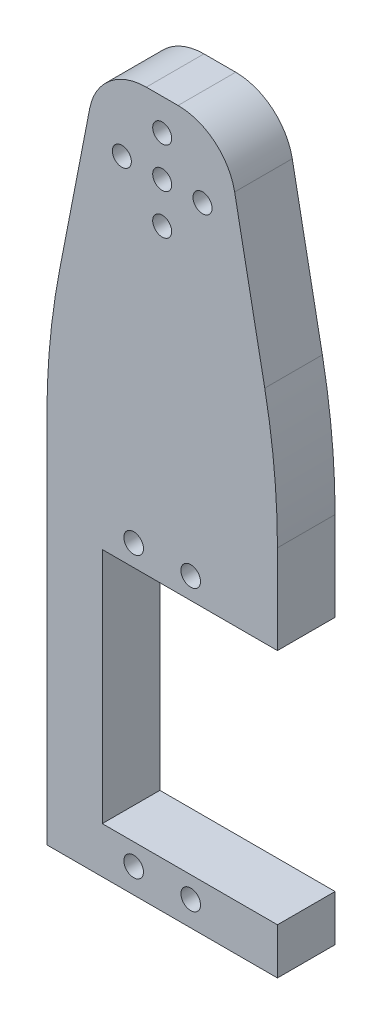
ISO-10303-21;
HEADER;
FILE_DESCRIPTION(('STEP AP214'),'2;1');
FILE_NAME('part.step','',(''),(''),'','','');
FILE_SCHEMA(('AUTOMOTIVE_DESIGN { 1 0 10303 214 1 1 1 1 }'));
ENDSEC;
DATA;
#1=APPLICATION_CONTEXT('core data for automotive mechanical design processes');
#2=APPLICATION_PROTOCOL_DEFINITION('international standard','automotive_design',2000,#1);
#3=PRODUCT_CONTEXT('',#1,'mechanical');
#4=PRODUCT('Part','Part','',(#3));
#5=PRODUCT_RELATED_PRODUCT_CATEGORY('part','',(#4));
#6=PRODUCT_DEFINITION_FORMATION('','',#4);
#7=PRODUCT_DEFINITION_CONTEXT('part definition',#1,'design');
#8=PRODUCT_DEFINITION('design','',#6,#7);
#9=PRODUCT_DEFINITION_SHAPE('','',#8);
#10=(LENGTH_UNIT() NAMED_UNIT(*) SI_UNIT(.MILLI.,.METRE.));
#11=(NAMED_UNIT(*) PLANE_ANGLE_UNIT() SI_UNIT($,.RADIAN.));
#12=(NAMED_UNIT(*) SI_UNIT($,.STERADIAN.) SOLID_ANGLE_UNIT());
#13=UNCERTAINTY_MEASURE_WITH_UNIT(LENGTH_MEASURE(1.E-05),#10,'distance_accuracy_value','');
#14=(GEOMETRIC_REPRESENTATION_CONTEXT(3) GLOBAL_UNCERTAINTY_ASSIGNED_CONTEXT((#13)) GLOBAL_UNIT_ASSIGNED_CONTEXT((#10,
#11,#12)) REPRESENTATION_CONTEXT('',''));
#15=CARTESIAN_POINT('',(0.,0.,0.));
#16=DIRECTION('',(0.,0.,1.));
#17=DIRECTION('',(1.,0.,0.));
#18=AXIS2_PLACEMENT_3D('',#15,#16,#17);
#19=CARTESIAN_POINT('',(0.,122.5,10.));
#20=DIRECTION('',(-1.,0.,0.));
#21=DIRECTION('',(0.,-1.,0.));
#22=AXIS2_PLACEMENT_3D('',#19,#20,#21);
#23=PLANE('',#22);
#24=DIRECTION('',(0.,1.,0.));
#25=VECTOR('',#24,1.);
#26=CARTESIAN_POINT('',(0.,122.5,0.));
#27=LINE('',#26,#25);
#28=CARTESIAN_POINT('',(0.,49.2,0.));
#29=VERTEX_POINT('',#28);
#30=CARTESIAN_POINT('',(0.,64.6443280725628,0.));
#31=VERTEX_POINT('',#30);
#32=EDGE_CURVE('E182',#29,#31,#27,.T.);
#33=ORIENTED_EDGE('',*,*,#32,.T.);
#34=DIRECTION('',(0.,0.,1.));
#35=VECTOR('',#34,1.);
#36=CARTESIAN_POINT('',(0.,64.6443280725628,10.));
#37=LINE('',#36,#35);
#38=CARTESIAN_POINT('',(0.,64.6443280725628,10.));
#39=VERTEX_POINT('',#38);
#40=EDGE_CURVE('E236',#31,#39,#37,.T.);
#41=ORIENTED_EDGE('',*,*,#40,.T.);
#42=DIRECTION('',(0.,1.,0.));
#43=VECTOR('',#42,1.);
#44=CARTESIAN_POINT('',(0.,122.5,10.));
#45=LINE('',#44,#43);
#46=CARTESIAN_POINT('',(0.,49.2,10.));
#47=VERTEX_POINT('',#46);
#48=EDGE_CURVE('E285',#47,#39,#45,.T.);
#49=ORIENTED_EDGE('',*,*,#48,.F.);
#50=DIRECTION('',(0.,0.,1.));
#51=VECTOR('',#50,1.);
#52=CARTESIAN_POINT('',(0.,49.2,0.));
#53=LINE('',#52,#51);
#54=EDGE_CURVE('E173',#29,#47,#53,.T.);
#55=ORIENTED_EDGE('',*,*,#54,.F.);
#56=EDGE_LOOP('',(#33,#41,#49,#55));
#57=FACE_BOUND('',#56,.T.);
#58=ADVANCED_FACE('F45',(#57),#23,.F.);
#59=CARTESIAN_POINT('',(0.,0.,10.));
#60=DIRECTION('',(0.,0.,1.));
#61=DIRECTION('',(1.,0.,0.));
#62=AXIS2_PLACEMENT_3D('',#59,#60,#61);
#63=PLANE('',#62);
#64=DIRECTION('',(-1.,0.,0.));
#65=VECTOR('',#64,1.);
#66=CARTESIAN_POINT('',(-40.,122.5,10.));
#67=LINE('',#66,#65);
#68=CARTESIAN_POINT('',(-17.243363858175,122.5,10.));
#69=VERTEX_POINT('',#68);
#70=CARTESIAN_POINT('',(-22.756636141825,122.5,10.));
#71=VERTEX_POINT('',#70);
#72=EDGE_CURVE('E197',#69,#71,#67,.T.);
#73=ORIENTED_EDGE('',*,*,#72,.T.);
#74=CARTESIAN_POINT('',(-22.756636141825,112.5,10.));
#75=DIRECTION('',(0.,0.,1.));
#76=DIRECTION('',(1.,0.,0.));
#77=AXIS2_PLACEMENT_3D('',#74,#75,#76);
#78=CIRCLE('',#77,10.);
#79=CARTESIAN_POINT('',(-32.5729079763017,114.408089953765,10.));
#80=VERTEX_POINT('',#79);
#81=EDGE_CURVE('E249',#71,#80,#78,.T.);
#82=ORIENTED_EDGE('',*,*,#81,.T.);
#83=DIRECTION('',(-0.190808995376545,-0.981627183447664,0.));
#84=VECTOR('',#83,1.);
#85=CARTESIAN_POINT('',(-52.8160035925099,10.2663911057309,10.));
#86=LINE('',#85,#84);
#87=CARTESIAN_POINT('',(-37.7952620137197,87.541407517748,10.));
#88=VERTEX_POINT('',#87);
#89=EDGE_CURVE('E174',#88,#80,#86,.F.);
#90=ORIENTED_EDGE('',*,*,#89,.F.);
#91=CARTESIAN_POINT('',(80.,64.6443280725625,10.));
#92=DIRECTION('',(0.,0.,1.));
#93=DIRECTION('',(1.,0.,0.));
#94=AXIS2_PLACEMENT_3D('',#91,#92,#93);
#95=CIRCLE('',#94,120.);
#96=CARTESIAN_POINT('',(-40.,64.6443280725626,10.));
#97=VERTEX_POINT('',#96);
#98=EDGE_CURVE('E229',#88,#97,#95,.T.);
#99=ORIENTED_EDGE('',*,*,#98,.T.);
#100=DIRECTION('',(0.,-1.,0.));
#101=VECTOR('',#100,1.);
#102=CARTESIAN_POINT('',(-40.,122.5,10.));
#103=LINE('',#102,#101);
#104=CARTESIAN_POINT('',(-40.,0.,10.));
#105=VERTEX_POINT('',#104);
#106=EDGE_CURVE('E187',#97,#105,#103,.T.);
#107=ORIENTED_EDGE('',*,*,#106,.T.);
#108=DIRECTION('',(1.,0.,0.));
#109=VECTOR('',#108,1.);
#110=CARTESIAN_POINT('',(-40.,0.,10.));
#111=LINE('',#110,#109);
#112=CARTESIAN_POINT('',(0.,0.,10.));
#113=VERTEX_POINT('',#112);
#114=EDGE_CURVE('E282',#105,#113,#111,.T.);
#115=ORIENTED_EDGE('',*,*,#114,.T.);
#116=CARTESIAN_POINT('',(0.,8.,10.));
#117=VERTEX_POINT('',#116);
#118=EDGE_CURVE('E291',#113,#117,#45,.T.);
#119=ORIENTED_EDGE('',*,*,#118,.T.);
#120=DIRECTION('',(1.,0.,0.));
#121=VECTOR('',#120,1.);
#122=CARTESIAN_POINT('',(-30.4,8.,10.));
#123=LINE('',#122,#121);
#124=CARTESIAN_POINT('',(-30.4,8.,10.));
#125=VERTEX_POINT('',#124);
#126=EDGE_CURVE('E168',#125,#117,#123,.T.);
#127=ORIENTED_EDGE('',*,*,#126,.F.);
#128=DIRECTION('',(0.,-1.,0.));
#129=VECTOR('',#128,1.);
#130=CARTESIAN_POINT('',(-30.4,49.2,10.));
#131=LINE('',#130,#129);
#132=CARTESIAN_POINT('',(-30.4,49.2,10.));
#133=VERTEX_POINT('',#132);
#134=EDGE_CURVE('E335',#133,#125,#131,.T.);
#135=ORIENTED_EDGE('',*,*,#134,.F.);
#136=DIRECTION('',(-1.,0.,0.));
#137=VECTOR('',#136,1.);
#138=CARTESIAN_POINT('',(-9.60000000000001,49.2,10.));
#139=LINE('',#138,#137);
#140=EDGE_CURVE('E162',#47,#133,#139,.T.);
#141=ORIENTED_EDGE('',*,*,#140,.F.);
#142=ORIENTED_EDGE('',*,*,#48,.T.);
#143=CARTESIAN_POINT('',(-120.,64.6443280725628,10.));
#144=DIRECTION('',(0.,0.,1.));
#145=DIRECTION('',(1.,0.,0.));
#146=AXIS2_PLACEMENT_3D('',#143,#144,#145);
#147=CIRCLE('',#146,120.);
#148=CARTESIAN_POINT('',(-2.20473798628035,87.5414075177482,10.));
#149=VERTEX_POINT('',#148);
#150=EDGE_CURVE('E225',#39,#149,#147,.T.);
#151=ORIENTED_EDGE('',*,*,#150,.T.);
#152=DIRECTION('',(-0.190808995376545,0.981627183447664,0.));
#153=VECTOR('',#152,1.);
#154=CARTESIAN_POINT('',(14.2723265011741,2.77425923741268,10.));
#155=LINE('',#154,#153);
#156=CARTESIAN_POINT('',(-7.42709202369831,114.408089953765,10.));
#157=VERTEX_POINT('',#156);
#158=EDGE_CURVE('E202',#157,#149,#155,.F.);
#159=ORIENTED_EDGE('',*,*,#158,.F.);
#160=CARTESIAN_POINT('',(-17.243363858175,112.5,10.));
#161=DIRECTION('',(0.,0.,1.));
#162=DIRECTION('',(1.,0.,0.));
#163=AXIS2_PLACEMENT_3D('',#160,#161,#162);
#164=CIRCLE('',#163,10.);
#165=EDGE_CURVE('E246',#157,#69,#164,.T.);
#166=ORIENTED_EDGE('',*,*,#165,.T.);
#167=EDGE_LOOP('',(#73,#82,#90,#99,#107,#115,#119,#127,#135,#141,#142,#151,#159,#166));
#168=FACE_BOUND('',#167,.T.);
#169=CARTESIAN_POINT('',(-27.,110.,10.));
#170=DIRECTION('',(0.,0.,1.));
#171=DIRECTION('',(1.,0.,0.));
#172=AXIS2_PLACEMENT_3D('',#169,#170,#171);
#173=CIRCLE('',#172,1.65);
#174=CARTESIAN_POINT('',(-25.35,110.,10.));
#175=VERTEX_POINT('',#174);
#176=EDGE_CURVE('E354',#175,#175,#173,.T.);
#177=ORIENTED_EDGE('',*,*,#176,.F.);
#178=EDGE_LOOP('',(#177));
#179=FACE_BOUND('',#178,.T.);
#180=CARTESIAN_POINT('',(-20.,117.,10.));
#181=DIRECTION('',(0.,0.,1.));
#182=DIRECTION('',(1.,0.,0.));
#183=AXIS2_PLACEMENT_3D('',#180,#181,#182);
#184=CIRCLE('',#183,1.65);
#185=CARTESIAN_POINT('',(-18.35,117.,10.));
#186=VERTEX_POINT('',#185);
#187=EDGE_CURVE('E362',#186,#186,#184,.T.);
#188=ORIENTED_EDGE('',*,*,#187,.F.);
#189=EDGE_LOOP('',(#188));
#190=FACE_BOUND('',#189,.T.);
#191=CARTESIAN_POINT('',(-13.,110.,10.));
#192=DIRECTION('',(0.,0.,1.));
#193=DIRECTION('',(1.,0.,0.));
#194=AXIS2_PLACEMENT_3D('',#191,#192,#193);
#195=CIRCLE('',#194,1.65);
#196=CARTESIAN_POINT('',(-11.35,110.,10.));
#197=VERTEX_POINT('',#196);
#198=EDGE_CURVE('E363',#197,#197,#195,.T.);
#199=ORIENTED_EDGE('',*,*,#198,.F.);
#200=EDGE_LOOP('',(#199));
#201=FACE_BOUND('',#200,.T.);
#202=CARTESIAN_POINT('',(-20.,103.,10.));
#203=DIRECTION('',(0.,0.,1.));
#204=DIRECTION('',(1.,0.,0.));
#205=AXIS2_PLACEMENT_3D('',#202,#203,#204);
#206=CIRCLE('',#205,1.65);
#207=CARTESIAN_POINT('',(-18.35,103.,10.));
#208=VERTEX_POINT('',#207);
#209=EDGE_CURVE('E378',#208,#208,#206,.T.);
#210=ORIENTED_EDGE('',*,*,#209,.F.);
#211=EDGE_LOOP('',(#210));
#212=FACE_BOUND('',#211,.T.);
#213=CARTESIAN_POINT('',(-20.,110.,10.));
#214=DIRECTION('',(0.,0.,1.));
#215=DIRECTION('',(1.,0.,0.));
#216=AXIS2_PLACEMENT_3D('',#213,#214,#215);
#217=CIRCLE('',#216,1.65);
#218=CARTESIAN_POINT('',(-18.35,110.,10.));
#219=VERTEX_POINT('',#218);
#220=EDGE_CURVE('E350',#219,#219,#217,.T.);
#221=ORIENTED_EDGE('',*,*,#220,.F.);
#222=EDGE_LOOP('',(#221));
#223=FACE_BOUND('',#222,.T.);
#224=CARTESIAN_POINT('',(-24.95,4.3,10.));
#225=DIRECTION('',(0.,0.,1.));
#226=DIRECTION('',(1.,0.,0.));
#227=AXIS2_PLACEMENT_3D('',#224,#225,#226);
#228=CIRCLE('',#227,1.70000000000001);
#229=CARTESIAN_POINT('',(-23.25,4.3,10.));
#230=VERTEX_POINT('',#229);
#231=EDGE_CURVE('E316',#230,#230,#228,.T.);
#232=ORIENTED_EDGE('',*,*,#231,.F.);
#233=EDGE_LOOP('',(#232));
#234=FACE_BOUND('',#233,.T.);
#235=CARTESIAN_POINT('',(-15.05,4.30000000000001,10.));
#236=DIRECTION('',(0.,0.,1.));
#237=DIRECTION('',(1.,0.,0.));
#238=AXIS2_PLACEMENT_3D('',#235,#236,#237);
#239=CIRCLE('',#238,1.70000000000001);
#240=CARTESIAN_POINT('',(-13.35,4.30000000000001,10.));
#241=VERTEX_POINT('',#240);
#242=EDGE_CURVE('E297',#241,#241,#239,.T.);
#243=ORIENTED_EDGE('',*,*,#242,.F.);
#244=EDGE_LOOP('',(#243));
#245=FACE_BOUND('',#244,.T.);
#246=CARTESIAN_POINT('',(-24.95,52.9,10.));
#247=DIRECTION('',(0.,0.,-1.));
#248=DIRECTION('',(-1.,0.,0.));
#249=AXIS2_PLACEMENT_3D('',#246,#247,#248);
#250=CIRCLE('',#249,1.7);
#251=CARTESIAN_POINT('',(-26.65,52.9,10.));
#252=VERTEX_POINT('',#251);
#253=EDGE_CURVE('E323',#252,#252,#250,.T.);
#254=ORIENTED_EDGE('',*,*,#253,.T.);
#255=EDGE_LOOP('',(#254));
#256=FACE_BOUND('',#255,.T.);
#257=CARTESIAN_POINT('',(-15.05,52.9,10.));
#258=DIRECTION('',(0.,0.,-1.));
#259=DIRECTION('',(-1.,0.,0.));
#260=AXIS2_PLACEMENT_3D('',#257,#258,#259);
#261=CIRCLE('',#260,1.7);
#262=CARTESIAN_POINT('',(-16.75,52.9,10.));
#263=VERTEX_POINT('',#262);
#264=EDGE_CURVE('E307',#263,#263,#261,.T.);
#265=ORIENTED_EDGE('',*,*,#264,.T.);
#266=EDGE_LOOP('',(#265));
#267=FACE_BOUND('',#266,.T.);
#268=ADVANCED_FACE('F267',(#168,#179,#190,#201,#212,#223,#234,#245,#256,#267),#63,.T.);
#269=CARTESIAN_POINT('',(0.,0.,0.));
#270=DIRECTION('',(0.,0.,1.));
#271=DIRECTION('',(1.,0.,0.));
#272=AXIS2_PLACEMENT_3D('',#269,#270,#271);
#273=PLANE('',#272);
#274=CARTESIAN_POINT('',(-27.,110.,0.));
#275=DIRECTION('',(0.,0.,1.));
#276=DIRECTION('',(1.,0.,0.));
#277=AXIS2_PLACEMENT_3D('',#274,#275,#276);
#278=CIRCLE('',#277,1.65);
#279=CARTESIAN_POINT('',(-25.35,110.,0.));
#280=VERTEX_POINT('',#279);
#281=EDGE_CURVE('E367',#280,#280,#278,.T.);
#282=ORIENTED_EDGE('',*,*,#281,.T.);
#283=EDGE_LOOP('',(#282));
#284=FACE_BOUND('',#283,.T.);
#285=CARTESIAN_POINT('',(-20.,117.,0.));
#286=DIRECTION('',(0.,0.,1.));
#287=DIRECTION('',(1.,0.,0.));
#288=AXIS2_PLACEMENT_3D('',#285,#286,#287);
#289=CIRCLE('',#288,1.65);
#290=CARTESIAN_POINT('',(-18.35,117.,0.));
#291=VERTEX_POINT('',#290);
#292=EDGE_CURVE('E358',#291,#291,#289,.T.);
#293=ORIENTED_EDGE('',*,*,#292,.T.);
#294=EDGE_LOOP('',(#293));
#295=FACE_BOUND('',#294,.T.);
#296=CARTESIAN_POINT('',(-13.,110.,0.));
#297=DIRECTION('',(0.,0.,1.));
#298=DIRECTION('',(1.,0.,0.));
#299=AXIS2_PLACEMENT_3D('',#296,#297,#298);
#300=CIRCLE('',#299,1.65);
#301=CARTESIAN_POINT('',(-11.35,110.,0.));
#302=VERTEX_POINT('',#301);
#303=EDGE_CURVE('E382',#302,#302,#300,.T.);
#304=ORIENTED_EDGE('',*,*,#303,.T.);
#305=EDGE_LOOP('',(#304));
#306=FACE_BOUND('',#305,.T.);
#307=CARTESIAN_POINT('',(-20.,103.,0.));
#308=DIRECTION('',(0.,0.,1.));
#309=DIRECTION('',(1.,0.,0.));
#310=AXIS2_PLACEMENT_3D('',#307,#308,#309);
#311=CIRCLE('',#310,1.65);
#312=CARTESIAN_POINT('',(-18.35,103.,0.));
#313=VERTEX_POINT('',#312);
#314=EDGE_CURVE('E374',#313,#313,#311,.T.);
#315=ORIENTED_EDGE('',*,*,#314,.T.);
#316=EDGE_LOOP('',(#315));
#317=FACE_BOUND('',#316,.T.);
#318=CARTESIAN_POINT('',(-20.,110.,0.));
#319=DIRECTION('',(0.,0.,1.));
#320=DIRECTION('',(1.,0.,0.));
#321=AXIS2_PLACEMENT_3D('',#318,#319,#320);
#322=CIRCLE('',#321,1.65);
#323=CARTESIAN_POINT('',(-18.35,110.,0.));
#324=VERTEX_POINT('',#323);
#325=EDGE_CURVE('E328',#324,#324,#322,.T.);
#326=ORIENTED_EDGE('',*,*,#325,.T.);
#327=EDGE_LOOP('',(#326));
#328=FACE_BOUND('',#327,.T.);
#329=CARTESIAN_POINT('',(-24.95,4.3,0.));
#330=DIRECTION('',(0.,0.,1.));
#331=DIRECTION('',(1.,0.,0.));
#332=AXIS2_PLACEMENT_3D('',#329,#330,#331);
#333=CIRCLE('',#332,1.70000000000001);
#334=CARTESIAN_POINT('',(-23.25,4.3,0.));
#335=VERTEX_POINT('',#334);
#336=EDGE_CURVE('E305',#335,#335,#333,.T.);
#337=ORIENTED_EDGE('',*,*,#336,.T.);
#338=EDGE_LOOP('',(#337));
#339=FACE_BOUND('',#338,.T.);
#340=CARTESIAN_POINT('',(-24.95,52.9,0.));
#341=DIRECTION('',(0.,0.,-1.));
#342=DIRECTION('',(-1.,0.,0.));
#343=AXIS2_PLACEMENT_3D('',#340,#341,#342);
#344=CIRCLE('',#343,1.7);
#345=CARTESIAN_POINT('',(-26.65,52.9,0.));
#346=VERTEX_POINT('',#345);
#347=EDGE_CURVE('E327',#346,#346,#344,.T.);
#348=ORIENTED_EDGE('',*,*,#347,.F.);
#349=EDGE_LOOP('',(#348));
#350=FACE_BOUND('',#349,.T.);
#351=CARTESIAN_POINT('',(-15.05,4.30000000000001,0.));
#352=DIRECTION('',(0.,0.,1.));
#353=DIRECTION('',(1.,0.,0.));
#354=AXIS2_PLACEMENT_3D('',#351,#352,#353);
#355=CIRCLE('',#354,1.70000000000001);
#356=CARTESIAN_POINT('',(-13.35,4.30000000000001,0.));
#357=VERTEX_POINT('',#356);
#358=EDGE_CURVE('E288',#357,#357,#355,.T.);
#359=ORIENTED_EDGE('',*,*,#358,.T.);
#360=EDGE_LOOP('',(#359));
#361=FACE_BOUND('',#360,.T.);
#362=DIRECTION('',(-0.190808995376545,-0.981627183447664,0.));
#363=VECTOR('',#362,1.);
#364=CARTESIAN_POINT('',(-52.8160035925099,10.2663911057309,0.));
#365=LINE('',#364,#363);
#366=CARTESIAN_POINT('',(-37.7952620137197,87.541407517748,0.));
#367=VERTEX_POINT('',#366);
#368=CARTESIAN_POINT('',(-32.5729079763017,114.408089953765,0.));
#369=VERTEX_POINT('',#368);
#370=EDGE_CURVE('E205',#367,#369,#365,.F.);
#371=ORIENTED_EDGE('',*,*,#370,.T.);
#372=CARTESIAN_POINT('',(-22.756636141825,112.5,0.));
#373=DIRECTION('',(0.,0.,1.));
#374=DIRECTION('',(1.,0.,0.));
#375=AXIS2_PLACEMENT_3D('',#372,#373,#374);
#376=CIRCLE('',#375,10.);
#377=CARTESIAN_POINT('',(-22.756636141825,122.5,0.));
#378=VERTEX_POINT('',#377);
#379=EDGE_CURVE('E54',#369,#378,#376,.F.);
#380=ORIENTED_EDGE('',*,*,#379,.T.);
#381=DIRECTION('',(-1.,0.,0.));
#382=VECTOR('',#381,1.);
#383=CARTESIAN_POINT('',(-40.,122.5,0.));
#384=LINE('',#383,#382);
#385=CARTESIAN_POINT('',(-17.243363858175,122.5,0.));
#386=VERTEX_POINT('',#385);
#387=EDGE_CURVE('E181',#386,#378,#384,.T.);
#388=ORIENTED_EDGE('',*,*,#387,.F.);
#389=CARTESIAN_POINT('',(-17.243363858175,112.5,0.));
#390=DIRECTION('',(0.,0.,1.));
#391=DIRECTION('',(1.,0.,0.));
#392=AXIS2_PLACEMENT_3D('',#389,#390,#391);
#393=CIRCLE('',#392,10.);
#394=CARTESIAN_POINT('',(-7.42709202369831,114.408089953765,0.));
#395=VERTEX_POINT('',#394);
#396=EDGE_CURVE('E61',#386,#395,#393,.F.);
#397=ORIENTED_EDGE('',*,*,#396,.T.);
#398=DIRECTION('',(-0.190808995376545,0.981627183447664,0.));
#399=VECTOR('',#398,1.);
#400=CARTESIAN_POINT('',(14.2723265011741,2.77425923741268,0.));
#401=LINE('',#400,#399);
#402=CARTESIAN_POINT('',(-2.20473798628035,87.5414075177482,0.));
#403=VERTEX_POINT('',#402);
#404=EDGE_CURVE('E206',#395,#403,#401,.F.);
#405=ORIENTED_EDGE('',*,*,#404,.T.);
#406=CARTESIAN_POINT('',(-120.,64.6443280725628,0.));
#407=DIRECTION('',(0.,0.,1.));
#408=DIRECTION('',(1.,0.,0.));
#409=AXIS2_PLACEMENT_3D('',#406,#407,#408);
#410=CIRCLE('',#409,120.);
#411=EDGE_CURVE('E216',#403,#31,#410,.F.);
#412=ORIENTED_EDGE('',*,*,#411,.T.);
#413=ORIENTED_EDGE('',*,*,#32,.F.);
#414=DIRECTION('',(-1.,0.,0.));
#415=VECTOR('',#414,1.);
#416=CARTESIAN_POINT('',(-9.60000000000001,49.2,0.));
#417=LINE('',#416,#415);
#418=CARTESIAN_POINT('',(-30.4,49.2,0.));
#419=VERTEX_POINT('',#418);
#420=EDGE_CURVE('E312',#29,#419,#417,.T.);
#421=ORIENTED_EDGE('',*,*,#420,.T.);
#422=DIRECTION('',(0.,-1.,0.));
#423=VECTOR('',#422,1.);
#424=CARTESIAN_POINT('',(-30.4,49.2,0.));
#425=LINE('',#424,#423);
#426=CARTESIAN_POINT('',(-30.4,8.,0.));
#427=VERTEX_POINT('',#426);
#428=EDGE_CURVE('E158',#419,#427,#425,.T.);
#429=ORIENTED_EDGE('',*,*,#428,.T.);
#430=DIRECTION('',(1.,0.,0.));
#431=VECTOR('',#430,1.);
#432=CARTESIAN_POINT('',(-30.4,8.,0.));
#433=LINE('',#432,#431);
#434=CARTESIAN_POINT('',(0.,8.,0.));
#435=VERTEX_POINT('',#434);
#436=EDGE_CURVE('E150',#427,#435,#433,.T.);
#437=ORIENTED_EDGE('',*,*,#436,.T.);
#438=CARTESIAN_POINT('',(0.,0.,0.));
#439=VERTEX_POINT('',#438);
#440=EDGE_CURVE('E156',#439,#435,#27,.T.);
#441=ORIENTED_EDGE('',*,*,#440,.F.);
#442=DIRECTION('',(1.,0.,0.));
#443=VECTOR('',#442,1.);
#444=CARTESIAN_POINT('',(-40.,0.,0.));
#445=LINE('',#444,#443);
#446=CARTESIAN_POINT('',(-40.,0.,0.));
#447=VERTEX_POINT('',#446);
#448=EDGE_CURVE('E190',#447,#439,#445,.T.);
#449=ORIENTED_EDGE('',*,*,#448,.F.);
#450=DIRECTION('',(0.,-1.,0.));
#451=VECTOR('',#450,1.);
#452=CARTESIAN_POINT('',(-40.,122.5,0.));
#453=LINE('',#452,#451);
#454=CARTESIAN_POINT('',(-40.,64.6443280725626,0.));
#455=VERTEX_POINT('',#454);
#456=EDGE_CURVE('E295',#455,#447,#453,.T.);
#457=ORIENTED_EDGE('',*,*,#456,.F.);
#458=CARTESIAN_POINT('',(80.,64.6443280725625,0.));
#459=DIRECTION('',(0.,0.,1.));
#460=DIRECTION('',(1.,0.,0.));
#461=AXIS2_PLACEMENT_3D('',#458,#459,#460);
#462=CIRCLE('',#461,120.);
#463=EDGE_CURVE('E219',#455,#367,#462,.F.);
#464=ORIENTED_EDGE('',*,*,#463,.T.);
#465=EDGE_LOOP('',(#371,#380,#388,#397,#405,#412,#413,#421,#429,#437,#441,#449,#457,#464));
#466=FACE_BOUND('',#465,.T.);
#467=CARTESIAN_POINT('',(-15.05,52.9,0.));
#468=DIRECTION('',(0.,0.,-1.));
#469=DIRECTION('',(-1.,0.,0.));
#470=AXIS2_PLACEMENT_3D('',#467,#468,#469);
#471=CIRCLE('',#470,1.7);
#472=CARTESIAN_POINT('',(-16.75,52.9,0.));
#473=VERTEX_POINT('',#472);
#474=EDGE_CURVE('E311',#473,#473,#471,.T.);
#475=ORIENTED_EDGE('',*,*,#474,.F.);
#476=EDGE_LOOP('',(#475));
#477=FACE_BOUND('',#476,.T.);
#478=ADVANCED_FACE('F152',(#284,#295,#306,#317,#328,#339,#350,#361,#466,#477),#273,.F.);
#479=CARTESIAN_POINT('',(-40.,122.5,10.));
#480=DIRECTION('',(1.,0.,0.));
#481=DIRECTION('',(0.,1.,0.));
#482=AXIS2_PLACEMENT_3D('',#479,#480,#481);
#483=PLANE('',#482);
#484=ORIENTED_EDGE('',*,*,#106,.F.);
#485=DIRECTION('',(0.,0.,1.));
#486=VECTOR('',#485,1.);
#487=CARTESIAN_POINT('',(-40.,64.6443280725626,10.));
#488=LINE('',#487,#486);
#489=EDGE_CURVE('E201',#97,#455,#488,.F.);
#490=ORIENTED_EDGE('',*,*,#489,.T.);
#491=ORIENTED_EDGE('',*,*,#456,.T.);
#492=DIRECTION('',(0.,0.,-1.));
#493=VECTOR('',#492,1.);
#494=CARTESIAN_POINT('',(-40.,0.,10.));
#495=LINE('',#494,#493);
#496=EDGE_CURVE('E196',#105,#447,#495,.T.);
#497=ORIENTED_EDGE('',*,*,#496,.F.);
#498=EDGE_LOOP('',(#484,#490,#491,#497));
#499=FACE_BOUND('',#498,.T.);
#500=ADVANCED_FACE('F279',(#499),#483,.F.);
#501=CARTESIAN_POINT('',(-40.,0.,10.));
#502=DIRECTION('',(0.,1.,0.));
#503=DIRECTION('',(0.,0.,1.));
#504=AXIS2_PLACEMENT_3D('',#501,#502,#503);
#505=PLANE('',#504);
#506=ORIENTED_EDGE('',*,*,#448,.T.);
#507=DIRECTION('',(0.,0.,-1.));
#508=VECTOR('',#507,1.);
#509=CARTESIAN_POINT('',(0.,0.,10.));
#510=LINE('',#509,#508);
#511=EDGE_CURVE('E179',#113,#439,#510,.T.);
#512=ORIENTED_EDGE('',*,*,#511,.F.);
#513=ORIENTED_EDGE('',*,*,#114,.F.);
#514=ORIENTED_EDGE('',*,*,#496,.T.);
#515=EDGE_LOOP('',(#506,#512,#513,#514));
#516=FACE_BOUND('',#515,.T.);
#517=ADVANCED_FACE('F427',(#516),#505,.F.);
#518=ORIENTED_EDGE('',*,*,#440,.T.);
#519=DIRECTION('',(0.,0.,1.));
#520=VECTOR('',#519,1.);
#521=CARTESIAN_POINT('',(0.,8.,0.));
#522=LINE('',#521,#520);
#523=EDGE_CURVE('E165',#435,#117,#522,.T.);
#524=ORIENTED_EDGE('',*,*,#523,.T.);
#525=ORIENTED_EDGE('',*,*,#118,.F.);
#526=ORIENTED_EDGE('',*,*,#511,.T.);
#527=EDGE_LOOP('',(#518,#524,#525,#526));
#528=FACE_BOUND('',#527,.T.);
#529=ADVANCED_FACE('F177',(#528),#23,.F.);
#530=CARTESIAN_POINT('',(-40.,122.5,10.));
#531=DIRECTION('',(0.,-1.,0.));
#532=DIRECTION('',(0.,0.,-1.));
#533=AXIS2_PLACEMENT_3D('',#530,#531,#532);
#534=PLANE('',#533);
#535=ORIENTED_EDGE('',*,*,#387,.T.);
#536=DIRECTION('',(0.,0.,-1.));
#537=VECTOR('',#536,1.);
#538=CARTESIAN_POINT('',(-22.756636141825,122.5,10.));
#539=LINE('',#538,#537);
#540=EDGE_CURVE('E242',#378,#71,#539,.F.);
#541=ORIENTED_EDGE('',*,*,#540,.T.);
#542=ORIENTED_EDGE('',*,*,#72,.F.);
#543=DIRECTION('',(0.,0.,-1.));
#544=VECTOR('',#543,1.);
#545=CARTESIAN_POINT('',(-17.243363858175,122.5,10.));
#546=LINE('',#545,#544);
#547=EDGE_CURVE('E239',#69,#386,#546,.T.);
#548=ORIENTED_EDGE('',*,*,#547,.T.);
#549=EDGE_LOOP('',(#535,#541,#542,#548));
#550=FACE_BOUND('',#549,.T.);
#551=ADVANCED_FACE('F260',(#550),#534,.F.);
#552=CARTESIAN_POINT('',(-15.05,4.30000000000001,10.));
#553=DIRECTION('',(0.,0.,-1.));
#554=DIRECTION('',(-1.,0.,0.));
#555=AXIS2_PLACEMENT_3D('',#552,#553,#554);
#556=CYLINDRICAL_SURFACE('',#555,1.70000000000001);
#557=ORIENTED_EDGE('',*,*,#242,.T.);
#558=EDGE_LOOP('',(#557));
#559=FACE_BOUND('',#558,.T.);
#560=ORIENTED_EDGE('',*,*,#358,.F.);
#561=EDGE_LOOP('',(#560));
#562=FACE_BOUND('',#561,.T.);
#563=ADVANCED_FACE('F433',(#559,#562),#556,.F.);
#564=CARTESIAN_POINT('',(-24.95,52.9,10.));
#565=DIRECTION('',(0.,0.,-1.));
#566=DIRECTION('',(-1.,0.,0.));
#567=AXIS2_PLACEMENT_3D('',#564,#565,#566);
#568=CYLINDRICAL_SURFACE('',#567,1.7);
#569=ORIENTED_EDGE('',*,*,#253,.F.);
#570=EDGE_LOOP('',(#569));
#571=FACE_BOUND('',#570,.T.);
#572=ORIENTED_EDGE('',*,*,#347,.T.);
#573=EDGE_LOOP('',(#572));
#574=FACE_BOUND('',#573,.T.);
#575=ADVANCED_FACE('F588',(#571,#574),#568,.F.);
#576=CARTESIAN_POINT('',(-9.60000000000001,49.2,10.));
#577=DIRECTION('',(0.,-1.,0.));
#578=DIRECTION('',(0.,0.,-1.));
#579=AXIS2_PLACEMENT_3D('',#576,#577,#578);
#580=PLANE('',#579);
#581=ORIENTED_EDGE('',*,*,#420,.F.);
#582=ORIENTED_EDGE('',*,*,#54,.T.);
#583=ORIENTED_EDGE('',*,*,#140,.T.);
#584=DIRECTION('',(0.,0.,-1.));
#585=VECTOR('',#584,1.);
#586=CARTESIAN_POINT('',(-30.4,49.2,10.));
#587=LINE('',#586,#585);
#588=EDGE_CURVE('E332',#133,#419,#587,.T.);
#589=ORIENTED_EDGE('',*,*,#588,.T.);
#590=EDGE_LOOP('',(#581,#582,#583,#589));
#591=FACE_BOUND('',#590,.T.);
#592=ADVANCED_FACE('F394',(#591),#580,.T.);
#593=CARTESIAN_POINT('',(-30.4,49.2,10.));
#594=DIRECTION('',(1.,0.,0.));
#595=DIRECTION('',(0.,1.,0.));
#596=AXIS2_PLACEMENT_3D('',#593,#594,#595);
#597=PLANE('',#596);
#598=ORIENTED_EDGE('',*,*,#428,.F.);
#599=ORIENTED_EDGE('',*,*,#588,.F.);
#600=ORIENTED_EDGE('',*,*,#134,.T.);
#601=DIRECTION('',(0.,0.,-1.));
#602=VECTOR('',#601,1.);
#603=CARTESIAN_POINT('',(-30.4,8.,10.));
#604=LINE('',#603,#602);
#605=EDGE_CURVE('E340',#125,#427,#604,.T.);
#606=ORIENTED_EDGE('',*,*,#605,.T.);
#607=EDGE_LOOP('',(#598,#599,#600,#606));
#608=FACE_BOUND('',#607,.T.);
#609=ADVANCED_FACE('F573',(#608),#597,.T.);
#610=CARTESIAN_POINT('',(-30.4,8.,10.));
#611=DIRECTION('',(0.,1.,0.));
#612=DIRECTION('',(-1.,0.,0.));
#613=AXIS2_PLACEMENT_3D('',#610,#611,#612);
#614=PLANE('',#613);
#615=ORIENTED_EDGE('',*,*,#436,.F.);
#616=ORIENTED_EDGE('',*,*,#605,.F.);
#617=ORIENTED_EDGE('',*,*,#126,.T.);
#618=ORIENTED_EDGE('',*,*,#523,.F.);
#619=EDGE_LOOP('',(#615,#616,#617,#618));
#620=FACE_BOUND('',#619,.T.);
#621=ADVANCED_FACE('F166',(#620),#614,.T.);
#622=CARTESIAN_POINT('',(-15.05,52.9,10.));
#623=DIRECTION('',(0.,0.,-1.));
#624=DIRECTION('',(-1.,0.,0.));
#625=AXIS2_PLACEMENT_3D('',#622,#623,#624);
#626=CYLINDRICAL_SURFACE('',#625,1.7);
#627=ORIENTED_EDGE('',*,*,#264,.F.);
#628=EDGE_LOOP('',(#627));
#629=FACE_BOUND('',#628,.T.);
#630=ORIENTED_EDGE('',*,*,#474,.T.);
#631=EDGE_LOOP('',(#630));
#632=FACE_BOUND('',#631,.T.);
#633=ADVANCED_FACE('F557',(#629,#632),#626,.F.);
#634=CARTESIAN_POINT('',(-24.95,4.3,10.));
#635=DIRECTION('',(0.,0.,-1.));
#636=DIRECTION('',(-1.,0.,0.));
#637=AXIS2_PLACEMENT_3D('',#634,#635,#636);
#638=CYLINDRICAL_SURFACE('',#637,1.70000000000001);
#639=ORIENTED_EDGE('',*,*,#231,.T.);
#640=EDGE_LOOP('',(#639));
#641=FACE_BOUND('',#640,.T.);
#642=ORIENTED_EDGE('',*,*,#336,.F.);
#643=EDGE_LOOP('',(#642));
#644=FACE_BOUND('',#643,.T.);
#645=ADVANCED_FACE('F548',(#641,#644),#638,.F.);
#646=CARTESIAN_POINT('',(-20.,110.,0.));
#647=DIRECTION('',(0.,0.,1.));
#648=DIRECTION('',(1.,0.,0.));
#649=AXIS2_PLACEMENT_3D('',#646,#647,#648);
#650=CYLINDRICAL_SURFACE('',#649,1.65);
#651=ORIENTED_EDGE('',*,*,#325,.F.);
#652=EDGE_LOOP('',(#651));
#653=FACE_BOUND('',#652,.T.);
#654=ORIENTED_EDGE('',*,*,#220,.T.);
#655=EDGE_LOOP('',(#654));
#656=FACE_BOUND('',#655,.T.);
#657=ADVANCED_FACE('F539',(#653,#656),#650,.F.);
#658=CARTESIAN_POINT('',(-20.,103.,0.));
#659=DIRECTION('',(0.,0.,1.));
#660=DIRECTION('',(1.,0.,0.));
#661=AXIS2_PLACEMENT_3D('',#658,#659,#660);
#662=CYLINDRICAL_SURFACE('',#661,1.65);
#663=ORIENTED_EDGE('',*,*,#314,.F.);
#664=EDGE_LOOP('',(#663));
#665=FACE_BOUND('',#664,.T.);
#666=ORIENTED_EDGE('',*,*,#209,.T.);
#667=EDGE_LOOP('',(#666));
#668=FACE_BOUND('',#667,.T.);
#669=ADVANCED_FACE('F530',(#665,#668),#662,.F.);
#670=CARTESIAN_POINT('',(-13.,110.,0.));
#671=DIRECTION('',(0.,0.,1.));
#672=DIRECTION('',(1.,0.,0.));
#673=AXIS2_PLACEMENT_3D('',#670,#671,#672);
#674=CYLINDRICAL_SURFACE('',#673,1.65);
#675=ORIENTED_EDGE('',*,*,#303,.F.);
#676=EDGE_LOOP('',(#675));
#677=FACE_BOUND('',#676,.T.);
#678=ORIENTED_EDGE('',*,*,#198,.T.);
#679=EDGE_LOOP('',(#678));
#680=FACE_BOUND('',#679,.T.);
#681=ADVANCED_FACE('F521',(#677,#680),#674,.F.);
#682=CARTESIAN_POINT('',(-20.,117.,0.));
#683=DIRECTION('',(0.,0.,1.));
#684=DIRECTION('',(1.,0.,0.));
#685=AXIS2_PLACEMENT_3D('',#682,#683,#684);
#686=CYLINDRICAL_SURFACE('',#685,1.65);
#687=ORIENTED_EDGE('',*,*,#292,.F.);
#688=EDGE_LOOP('',(#687));
#689=FACE_BOUND('',#688,.T.);
#690=ORIENTED_EDGE('',*,*,#187,.T.);
#691=EDGE_LOOP('',(#690));
#692=FACE_BOUND('',#691,.T.);
#693=ADVANCED_FACE('F512',(#689,#692),#686,.F.);
#694=CARTESIAN_POINT('',(-27.,110.,0.));
#695=DIRECTION('',(0.,0.,1.));
#696=DIRECTION('',(1.,0.,0.));
#697=AXIS2_PLACEMENT_3D('',#694,#695,#696);
#698=CYLINDRICAL_SURFACE('',#697,1.65);
#699=ORIENTED_EDGE('',*,*,#281,.F.);
#700=EDGE_LOOP('',(#699));
#701=FACE_BOUND('',#700,.T.);
#702=ORIENTED_EDGE('',*,*,#176,.T.);
#703=EDGE_LOOP('',(#702));
#704=FACE_BOUND('',#703,.T.);
#705=ADVANCED_FACE('F443',(#701,#704),#698,.F.);
#706=CARTESIAN_POINT('',(-9.,122.5,0.));
#707=DIRECTION('',(0.981627183447664,0.190808995376545,0.));
#708=DIRECTION('',(-0.190808995376545,0.981627183447664,0.));
#709=AXIS2_PLACEMENT_3D('',#706,#707,#708);
#710=PLANE('',#709);
#711=ORIENTED_EDGE('',*,*,#404,.F.);
#712=DIRECTION('',(0.,0.,1.));
#713=VECTOR('',#712,1.);
#714=CARTESIAN_POINT('',(-7.42709202369831,114.408089953765,0.));
#715=LINE('',#714,#713);
#716=EDGE_CURVE('E11',#395,#157,#715,.T.);
#717=ORIENTED_EDGE('',*,*,#716,.T.);
#718=ORIENTED_EDGE('',*,*,#158,.T.);
#719=DIRECTION('',(0.,0.,-1.));
#720=VECTOR('',#719,1.);
#721=CARTESIAN_POINT('',(-2.20473798628035,87.5414075177482,0.));
#722=LINE('',#721,#720);
#723=EDGE_CURVE('E232',#149,#403,#722,.T.);
#724=ORIENTED_EDGE('',*,*,#723,.T.);
#725=EDGE_LOOP('',(#711,#717,#718,#724));
#726=FACE_BOUND('',#725,.T.);
#727=ADVANCED_FACE('F409',(#726),#710,.T.);
#728=CARTESIAN_POINT('',(-31.,122.5,0.));
#729=DIRECTION('',(-0.981627183447664,0.190808995376545,0.));
#730=DIRECTION('',(-0.190808995376545,-0.981627183447664,0.));
#731=AXIS2_PLACEMENT_3D('',#728,#729,#730);
#732=PLANE('',#731);
#733=ORIENTED_EDGE('',*,*,#89,.T.);
#734=DIRECTION('',(0.,0.,1.));
#735=VECTOR('',#734,1.);
#736=CARTESIAN_POINT('',(-32.5729079763017,114.408089953765,0.));
#737=LINE('',#736,#735);
#738=EDGE_CURVE('E69',#80,#369,#737,.F.);
#739=ORIENTED_EDGE('',*,*,#738,.T.);
#740=ORIENTED_EDGE('',*,*,#370,.F.);
#741=DIRECTION('',(0.,0.,-1.));
#742=VECTOR('',#741,1.);
#743=CARTESIAN_POINT('',(-37.7952620137197,87.541407517748,0.));
#744=LINE('',#743,#742);
#745=EDGE_CURVE('E222',#367,#88,#744,.F.);
#746=ORIENTED_EDGE('',*,*,#745,.T.);
#747=EDGE_LOOP('',(#733,#739,#740,#746));
#748=FACE_BOUND('',#747,.T.);
#749=ADVANCED_FACE('F270',(#748),#732,.T.);
#750=CARTESIAN_POINT('',(80.,64.6443280725625,10.));
#751=DIRECTION('',(0.,0.,1.));
#752=DIRECTION('',(1.,0.,0.));
#753=AXIS2_PLACEMENT_3D('',#750,#751,#752);
#754=CYLINDRICAL_SURFACE('',#753,120.);
#755=ORIENTED_EDGE('',*,*,#98,.F.);
#756=ORIENTED_EDGE('',*,*,#745,.F.);
#757=ORIENTED_EDGE('',*,*,#463,.F.);
#758=ORIENTED_EDGE('',*,*,#489,.F.);
#759=EDGE_LOOP('',(#755,#756,#757,#758));
#760=FACE_BOUND('',#759,.T.);
#761=ADVANCED_FACE('F273',(#760),#754,.T.);
#762=CARTESIAN_POINT('',(-120.,64.6443280725628,0.));
#763=DIRECTION('',(0.,0.,1.));
#764=DIRECTION('',(1.,0.,0.));
#765=AXIS2_PLACEMENT_3D('',#762,#763,#764);
#766=CYLINDRICAL_SURFACE('',#765,120.);
#767=ORIENTED_EDGE('',*,*,#150,.F.);
#768=ORIENTED_EDGE('',*,*,#40,.F.);
#769=ORIENTED_EDGE('',*,*,#411,.F.);
#770=ORIENTED_EDGE('',*,*,#723,.F.);
#771=EDGE_LOOP('',(#767,#768,#769,#770));
#772=FACE_BOUND('',#771,.T.);
#773=ADVANCED_FACE('F406',(#772),#766,.T.);
#774=CARTESIAN_POINT('',(-22.756636141825,112.5,10.));
#775=DIRECTION('',(0.,0.,-1.));
#776=DIRECTION('',(-1.,0.,0.));
#777=AXIS2_PLACEMENT_3D('',#774,#775,#776);
#778=CYLINDRICAL_SURFACE('',#777,10.);
#779=ORIENTED_EDGE('',*,*,#379,.F.);
#780=ORIENTED_EDGE('',*,*,#738,.F.);
#781=ORIENTED_EDGE('',*,*,#81,.F.);
#782=ORIENTED_EDGE('',*,*,#540,.F.);
#783=EDGE_LOOP('',(#779,#780,#781,#782));
#784=FACE_BOUND('',#783,.T.);
#785=ADVANCED_FACE('F264',(#784),#778,.T.);
#786=CARTESIAN_POINT('',(-17.243363858175,112.5,0.));
#787=DIRECTION('',(0.,0.,-1.));
#788=DIRECTION('',(-1.,0.,0.));
#789=AXIS2_PLACEMENT_3D('',#786,#787,#788);
#790=CYLINDRICAL_SURFACE('',#789,10.);
#791=ORIENTED_EDGE('',*,*,#396,.F.);
#792=ORIENTED_EDGE('',*,*,#547,.F.);
#793=ORIENTED_EDGE('',*,*,#165,.F.);
#794=ORIENTED_EDGE('',*,*,#716,.F.);
#795=EDGE_LOOP('',(#791,#792,#793,#794));
#796=FACE_BOUND('',#795,.T.);
#797=ADVANCED_FACE('F47',(#796),#790,.T.);
#798=CLOSED_SHELL('',(#58,#268,#478,#500,#517,#529,#551,#563,#575,#592,#609,#621,#633,#645,#657,
#669,#681,#693,#705,#727,#749,#761,#773,#785,#797));
#799=MANIFOLD_SOLID_BREP('B2',#798);
#800=ADVANCED_BREP_SHAPE_REPRESENTATION('',(#18,#799),#14);
#801=SHAPE_DEFINITION_REPRESENTATION(#9,#800);
ENDSEC;
END-ISO-10303-21;
